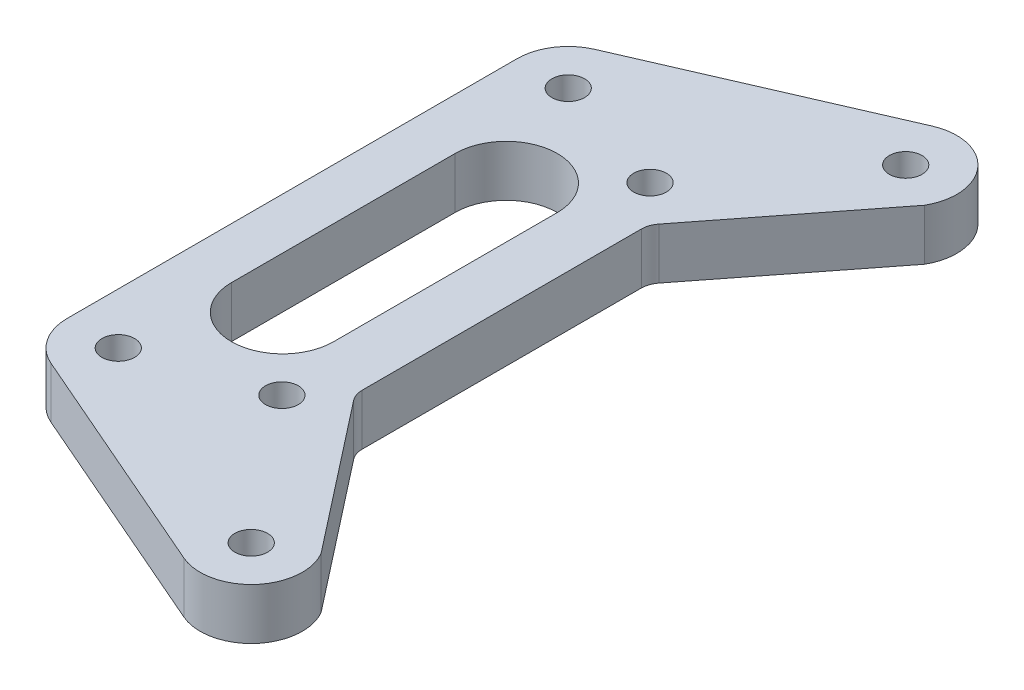
ISO-10303-21;
HEADER;
FILE_DESCRIPTION(('STEP AP214'),'2;1');
FILE_NAME('part.step','',(''),(''),'','','');
FILE_SCHEMA(('AUTOMOTIVE_DESIGN { 1 0 10303 214 1 1 1 1 }'));
ENDSEC;
DATA;
#1=APPLICATION_CONTEXT('core data for automotive mechanical design processes');
#2=APPLICATION_PROTOCOL_DEFINITION('international standard','automotive_design',2000,#1);
#3=PRODUCT_CONTEXT('',#1,'mechanical');
#4=PRODUCT('Part','Part','',(#3));
#5=PRODUCT_RELATED_PRODUCT_CATEGORY('part','',(#4));
#6=PRODUCT_DEFINITION_FORMATION('','',#4);
#7=PRODUCT_DEFINITION_CONTEXT('part definition',#1,'design');
#8=PRODUCT_DEFINITION('design','',#6,#7);
#9=PRODUCT_DEFINITION_SHAPE('','',#8);
#10=(LENGTH_UNIT() NAMED_UNIT(*) SI_UNIT(.MILLI.,.METRE.));
#11=(NAMED_UNIT(*) PLANE_ANGLE_UNIT() SI_UNIT($,.RADIAN.));
#12=(NAMED_UNIT(*) SI_UNIT($,.STERADIAN.) SOLID_ANGLE_UNIT());
#13=UNCERTAINTY_MEASURE_WITH_UNIT(LENGTH_MEASURE(1.E-05),#10,'distance_accuracy_value','');
#14=(GEOMETRIC_REPRESENTATION_CONTEXT(3) GLOBAL_UNCERTAINTY_ASSIGNED_CONTEXT((#13)) GLOBAL_UNIT_ASSIGNED_CONTEXT((#10,
#11,#12)) REPRESENTATION_CONTEXT('',''));
#15=CARTESIAN_POINT('',(0.,0.,0.));
#16=DIRECTION('',(0.,0.,1.));
#17=DIRECTION('',(1.,0.,0.));
#18=AXIS2_PLACEMENT_3D('',#15,#16,#17);
#19=CARTESIAN_POINT('',(2.58602666366907,5.,18.));
#20=DIRECTION('',(0.,-1.,0.));
#21=DIRECTION('',(0.,0.,-1.));
#22=AXIS2_PLACEMENT_3D('',#19,#20,#21);
#23=CYLINDRICAL_SURFACE('',#22,1.6);
#24=CARTESIAN_POINT('',(2.58602666366907,5.,18.));
#25=DIRECTION('',(0.,1.,0.));
#26=DIRECTION('',(0.,0.,-1.));
#27=AXIS2_PLACEMENT_3D('',#24,#25,#26);
#28=CIRCLE('',#27,1.6);
#29=CARTESIAN_POINT('',(2.58602666366907,5.,16.4));
#30=VERTEX_POINT('',#29);
#31=EDGE_CURVE('E196',#30,#30,#28,.T.);
#32=ORIENTED_EDGE('',*,*,#31,.T.);
#33=EDGE_LOOP('',(#32));
#34=FACE_BOUND('',#33,.T.);
#35=CARTESIAN_POINT('',(2.58602666366907,2.5,18.));
#36=DIRECTION('',(0.,-1.,0.));
#37=DIRECTION('',(0.,0.,-1.));
#38=AXIS2_PLACEMENT_3D('',#35,#36,#37);
#39=CIRCLE('',#38,1.6);
#40=CARTESIAN_POINT('',(2.58602666366907,2.5,16.4));
#41=VERTEX_POINT('',#40);
#42=EDGE_CURVE('E37',#41,#41,#39,.T.);
#43=ORIENTED_EDGE('',*,*,#42,.T.);
#44=EDGE_LOOP('',(#43));
#45=FACE_BOUND('',#44,.T.);
#46=ADVANCED_FACE('F33',(#34,#45),#23,.F.);
#47=CARTESIAN_POINT('',(2.58602666366907,5.,-18.));
#48=DIRECTION('',(0.,-1.,0.));
#49=DIRECTION('',(0.,0.,-1.));
#50=AXIS2_PLACEMENT_3D('',#47,#48,#49);
#51=CYLINDRICAL_SURFACE('',#50,1.6);
#52=CARTESIAN_POINT('',(2.58602666366907,5.,-18.));
#53=DIRECTION('',(0.,1.,0.));
#54=DIRECTION('',(0.,0.,1.));
#55=AXIS2_PLACEMENT_3D('',#52,#53,#54);
#56=CIRCLE('',#55,1.6);
#57=CARTESIAN_POINT('',(2.58602666366907,5.,-16.4));
#58=VERTEX_POINT('',#57);
#59=EDGE_CURVE('E201',#58,#58,#56,.T.);
#60=ORIENTED_EDGE('',*,*,#59,.T.);
#61=EDGE_LOOP('',(#60));
#62=FACE_BOUND('',#61,.T.);
#63=CARTESIAN_POINT('',(2.58602666366907,2.5,-18.));
#64=DIRECTION('',(0.,-1.,0.));
#65=DIRECTION('',(0.,0.,-1.));
#66=AXIS2_PLACEMENT_3D('',#63,#64,#65);
#67=CIRCLE('',#66,1.6);
#68=CARTESIAN_POINT('',(2.58602666366907,2.5,-19.6));
#69=VERTEX_POINT('',#68);
#70=EDGE_CURVE('E177',#69,#69,#67,.T.);
#71=ORIENTED_EDGE('',*,*,#70,.T.);
#72=EDGE_LOOP('',(#71));
#73=FACE_BOUND('',#72,.T.);
#74=ADVANCED_FACE('F330',(#62,#73),#51,.F.);
#75=CARTESIAN_POINT('',(8.15816423750236,5.,13.646692882615));
#76=DIRECTION('',(0.,-1.,0.));
#77=DIRECTION('',(0.,0.,-1.));
#78=AXIS2_PLACEMENT_3D('',#75,#76,#77);
#79=PLANE('',#78);
#80=CARTESIAN_POINT('',(-9.41397333633094,5.,22.));
#81=DIRECTION('',(0.,1.,0.));
#82=DIRECTION('',(0.,0.,-1.));
#83=AXIS2_PLACEMENT_3D('',#80,#81,#82);
#84=CIRCLE('',#83,1.6);
#85=CARTESIAN_POINT('',(-9.41397333633094,5.,20.4));
#86=VERTEX_POINT('',#85);
#87=EDGE_CURVE('E187',#86,#86,#84,.T.);
#88=ORIENTED_EDGE('',*,*,#87,.F.);
#89=EDGE_LOOP('',(#88));
#90=FACE_BOUND('',#89,.T.);
#91=ORIENTED_EDGE('',*,*,#31,.F.);
#92=EDGE_LOOP('',(#91));
#93=FACE_BOUND('',#92,.T.);
#94=CARTESIAN_POINT('',(13.5860266636691,5.,-32.));
#95=DIRECTION('',(0.,1.,0.));
#96=DIRECTION('',(0.,0.,1.));
#97=AXIS2_PLACEMENT_3D('',#94,#95,#96);
#98=CIRCLE('',#97,1.6);
#99=CARTESIAN_POINT('',(13.5860266636691,5.,-30.4));
#100=VERTEX_POINT('',#99);
#101=EDGE_CURVE('E205',#100,#100,#98,.T.);
#102=ORIENTED_EDGE('',*,*,#101,.F.);
#103=EDGE_LOOP('',(#102));
#104=FACE_BOUND('',#103,.T.);
#105=CARTESIAN_POINT('',(8.15816423750236,5.,13.646692882615));
#106=DIRECTION('',(0.,-1.,0.));
#107=DIRECTION('',(0.,0.,-1.));
#108=AXIS2_PLACEMENT_3D('',#105,#106,#107);
#109=CIRCLE('',#108,2.07106781186542);
#110=CARTESIAN_POINT('',(6.52612292783099,5.,14.9217470167093));
#111=VERTEX_POINT('',#110);
#112=CARTESIAN_POINT('',(6.08709642563693,5.,13.6466928826149));
#113=VERTEX_POINT('',#112);
#114=EDGE_CURVE('E217',#111,#113,#109,.T.);
#115=ORIENTED_EDGE('',*,*,#114,.T.);
#116=DIRECTION('',(0.,0.,-1.));
#117=VECTOR('',#116,1.);
#118=CARTESIAN_POINT('',(6.08709642563693,5.,-13.6466928826149));
#119=LINE('',#118,#117);
#120=CARTESIAN_POINT('',(6.08709642563693,5.,-13.6466928826149));
#121=VERTEX_POINT('',#120);
#122=EDGE_CURVE('E220',#113,#121,#119,.T.);
#123=ORIENTED_EDGE('',*,*,#122,.T.);
#124=CARTESIAN_POINT('',(8.15816423750236,5.,-13.646692882615));
#125=DIRECTION('',(0.,-1.,0.));
#126=DIRECTION('',(0.,0.,1.));
#127=AXIS2_PLACEMENT_3D('',#124,#125,#126);
#128=CIRCLE('',#127,2.07106781186542);
#129=CARTESIAN_POINT('',(6.52612292783099,5.,-14.9217470167093));
#130=VERTEX_POINT('',#129);
#131=EDGE_CURVE('E223',#121,#130,#128,.T.);
#132=ORIENTED_EDGE('',*,*,#131,.T.);
#133=DIRECTION('',(0.615650596658122,0.,-0.788019252832378));
#134=VECTOR('',#133,1.);
#135=CARTESIAN_POINT('',(6.52612292783099,5.,-14.9217470167093));
#136=LINE('',#135,#134);
#137=CARTESIAN_POINT('',(17.917777995013,5.,-29.5028155047335));
#138=VERTEX_POINT('',#137);
#139=EDGE_CURVE('E225',#130,#138,#136,.T.);
#140=ORIENTED_EDGE('',*,*,#139,.T.);
#141=CARTESIAN_POINT('',(13.5860266636691,5.,-32.));
#142=DIRECTION('',(0.,1.,0.));
#143=DIRECTION('',(0.,0.,1.));
#144=AXIS2_PLACEMENT_3D('',#141,#142,#143);
#145=CIRCLE('',#144,5.);
#146=CARTESIAN_POINT('',(11.5923961065968,5.,-36.5853502812662));
#147=VERTEX_POINT('',#146);
#148=EDGE_CURVE('E227',#138,#147,#145,.T.);
#149=ORIENTED_EDGE('',*,*,#148,.T.);
#150=DIRECTION('',(-0.917070056253235,0.,0.39872611141445));
#151=VECTOR('',#150,1.);
#152=CARTESIAN_POINT('',(-11.4076038934032,5.,-26.5853502812662));
#153=LINE('',#152,#151);
#154=CARTESIAN_POINT('',(-11.4076038934032,5.,-26.5853502812662));
#155=VERTEX_POINT('',#154);
#156=EDGE_CURVE('E229',#147,#155,#153,.T.);
#157=ORIENTED_EDGE('',*,*,#156,.T.);
#158=CARTESIAN_POINT('',(-9.41397333633094,5.,-22.));
#159=DIRECTION('',(0.,1.,0.));
#160=DIRECTION('',(0.,0.,1.));
#161=AXIS2_PLACEMENT_3D('',#158,#159,#160);
#162=CIRCLE('',#161,5.);
#163=CARTESIAN_POINT('',(-14.4139733363309,5.,-22.));
#164=VERTEX_POINT('',#163);
#165=EDGE_CURVE('E231',#155,#164,#162,.T.);
#166=ORIENTED_EDGE('',*,*,#165,.T.);
#167=DIRECTION('',(0.,0.,1.));
#168=VECTOR('',#167,1.);
#169=CARTESIAN_POINT('',(-14.4139733363309,5.,-22.));
#170=LINE('',#169,#168);
#171=CARTESIAN_POINT('',(-14.4139733363309,5.,22.));
#172=VERTEX_POINT('',#171);
#173=EDGE_CURVE('E233',#164,#172,#170,.T.);
#174=ORIENTED_EDGE('',*,*,#173,.T.);
#175=CARTESIAN_POINT('',(-9.41397333633094,5.,22.));
#176=DIRECTION('',(0.,1.,0.));
#177=DIRECTION('',(0.,0.,-1.));
#178=AXIS2_PLACEMENT_3D('',#175,#176,#177);
#179=CIRCLE('',#178,5.);
#180=CARTESIAN_POINT('',(-11.4076038934032,5.,26.5853502812662));
#181=VERTEX_POINT('',#180);
#182=EDGE_CURVE('E235',#172,#181,#179,.T.);
#183=ORIENTED_EDGE('',*,*,#182,.T.);
#184=DIRECTION('',(0.917070056253235,0.,0.39872611141445));
#185=VECTOR('',#184,1.);
#186=CARTESIAN_POINT('',(-11.4076038934032,5.,26.5853502812662));
#187=LINE('',#186,#185);
#188=CARTESIAN_POINT('',(11.5923961065968,5.,36.5853502812662));
#189=VERTEX_POINT('',#188);
#190=EDGE_CURVE('E237',#181,#189,#187,.T.);
#191=ORIENTED_EDGE('',*,*,#190,.T.);
#192=CARTESIAN_POINT('',(13.5860266636691,5.,32.));
#193=DIRECTION('',(0.,1.,0.));
#194=DIRECTION('',(0.,0.,-1.));
#195=AXIS2_PLACEMENT_3D('',#192,#193,#194);
#196=CIRCLE('',#195,5.);
#197=CARTESIAN_POINT('',(17.9177779950131,5.,29.5028155047335));
#198=VERTEX_POINT('',#197);
#199=EDGE_CURVE('E239',#189,#198,#196,.T.);
#200=ORIENTED_EDGE('',*,*,#199,.T.);
#201=DIRECTION('',(-0.615650596658122,0.,-0.788019252832378));
#202=VECTOR('',#201,1.);
#203=CARTESIAN_POINT('',(6.52612292783099,5.,14.9217470167093));
#204=LINE('',#203,#202);
#205=EDGE_CURVE('E241',#198,#111,#204,.T.);
#206=ORIENTED_EDGE('',*,*,#205,.T.);
#207=EDGE_LOOP('',(#115,#123,#132,#140,#149,#157,#166,#174,#183,#191,#200,#206));
#208=FACE_BOUND('',#207,.T.);
#209=CARTESIAN_POINT('',(-9.41397333633094,5.,-22.));
#210=DIRECTION('',(0.,1.,0.));
#211=DIRECTION('',(0.,0.,1.));
#212=AXIS2_PLACEMENT_3D('',#209,#210,#211);
#213=CIRCLE('',#212,1.6);
#214=CARTESIAN_POINT('',(-9.41397333633094,5.,-20.4));
#215=VERTEX_POINT('',#214);
#216=EDGE_CURVE('E211',#215,#215,#213,.T.);
#217=ORIENTED_EDGE('',*,*,#216,.F.);
#218=EDGE_LOOP('',(#217));
#219=FACE_BOUND('',#218,.T.);
#220=ORIENTED_EDGE('',*,*,#59,.F.);
#221=EDGE_LOOP('',(#220));
#222=FACE_BOUND('',#221,.T.);
#223=CARTESIAN_POINT('',(13.5860266636691,5.,32.));
#224=DIRECTION('',(0.,1.,0.));
#225=DIRECTION('',(0.,0.,-1.));
#226=AXIS2_PLACEMENT_3D('',#223,#224,#225);
#227=CIRCLE('',#226,1.6);
#228=CARTESIAN_POINT('',(13.5860266636691,5.,30.4));
#229=VERTEX_POINT('',#228);
#230=EDGE_CURVE('E193',#229,#229,#227,.T.);
#231=ORIENTED_EDGE('',*,*,#230,.F.);
#232=EDGE_LOOP('',(#231));
#233=FACE_BOUND('',#232,.T.);
#234=CARTESIAN_POINT('',(-4.41397333633093,5.,10.9356848269755));
#235=DIRECTION('',(0.,1.,0.));
#236=DIRECTION('',(0.,0.,-1.));
#237=AXIS2_PLACEMENT_3D('',#234,#235,#236);
#238=CIRCLE('',#237,5.);
#239=CARTESIAN_POINT('',(-9.41397333633094,5.,10.9356848269755));
#240=VERTEX_POINT('',#239);
#241=CARTESIAN_POINT('',(0.586026663669074,5.,10.9356848269755));
#242=VERTEX_POINT('',#241);
#243=EDGE_CURVE('E148',#240,#242,#238,.T.);
#244=ORIENTED_EDGE('',*,*,#243,.F.);
#245=DIRECTION('',(0.,0.,1.));
#246=VECTOR('',#245,1.);
#247=CARTESIAN_POINT('',(-9.41397333633094,5.,-10.9356848269755));
#248=LINE('',#247,#246);
#249=CARTESIAN_POINT('',(-9.41397333633094,5.,-10.9356848269755));
#250=VERTEX_POINT('',#249);
#251=EDGE_CURVE('E171',#250,#240,#248,.T.);
#252=ORIENTED_EDGE('',*,*,#251,.F.);
#253=CARTESIAN_POINT('',(-4.41397333633093,5.,-10.9356848269755));
#254=DIRECTION('',(0.,1.,0.));
#255=DIRECTION('',(0.,0.,1.));
#256=AXIS2_PLACEMENT_3D('',#253,#254,#255);
#257=CIRCLE('',#256,5.);
#258=CARTESIAN_POINT('',(0.586026663669074,5.,-10.9356848269755));
#259=VERTEX_POINT('',#258);
#260=EDGE_CURVE('E169',#259,#250,#257,.T.);
#261=ORIENTED_EDGE('',*,*,#260,.F.);
#262=DIRECTION('',(0.,0.,-1.));
#263=VECTOR('',#262,1.);
#264=CARTESIAN_POINT('',(0.586026663669074,5.,-10.9356848269755));
#265=LINE('',#264,#263);
#266=EDGE_CURVE('E156',#242,#259,#265,.T.);
#267=ORIENTED_EDGE('',*,*,#266,.F.);
#268=EDGE_LOOP('',(#244,#252,#261,#267));
#269=FACE_BOUND('',#268,.T.);
#270=ADVANCED_FACE('F168',(#90,#93,#104,#208,#219,#222,#233,#269),#79,.F.);
#271=CARTESIAN_POINT('',(8.15816423750236,0.,13.646692882615));
#272=DIRECTION('',(0.,-1.,0.));
#273=DIRECTION('',(0.,0.,-1.));
#274=AXIS2_PLACEMENT_3D('',#271,#272,#273);
#275=PLANE('',#274);
#276=CARTESIAN_POINT('',(2.58602666366907,0.,18.));
#277=DIRECTION('',(0.,-1.,0.));
#278=DIRECTION('',(0.,0.,-1.));
#279=AXIS2_PLACEMENT_3D('',#276,#277,#278);
#280=CIRCLE('',#279,3.);
#281=CARTESIAN_POINT('',(2.58602666366907,0.,15.));
#282=VERTEX_POINT('',#281);
#283=EDGE_CURVE('E308',#282,#282,#280,.T.);
#284=ORIENTED_EDGE('',*,*,#283,.F.);
#285=EDGE_LOOP('',(#284));
#286=FACE_BOUND('',#285,.T.);
#287=CARTESIAN_POINT('',(2.58602666366907,0.,-18.));
#288=DIRECTION('',(0.,-1.,0.));
#289=DIRECTION('',(0.,0.,-1.));
#290=AXIS2_PLACEMENT_3D('',#287,#288,#289);
#291=CIRCLE('',#290,3.);
#292=CARTESIAN_POINT('',(2.58602666366907,0.,-21.));
#293=VERTEX_POINT('',#292);
#294=EDGE_CURVE('E302',#293,#293,#291,.T.);
#295=ORIENTED_EDGE('',*,*,#294,.F.);
#296=EDGE_LOOP('',(#295));
#297=FACE_BOUND('',#296,.T.);
#298=CARTESIAN_POINT('',(-9.41397333633094,0.,22.));
#299=DIRECTION('',(0.,1.,0.));
#300=DIRECTION('',(0.,0.,-1.));
#301=AXIS2_PLACEMENT_3D('',#298,#299,#300);
#302=CIRCLE('',#301,1.6);
#303=CARTESIAN_POINT('',(-9.41397333633094,0.,20.4));
#304=VERTEX_POINT('',#303);
#305=EDGE_CURVE('E164',#304,#304,#302,.T.);
#306=ORIENTED_EDGE('',*,*,#305,.T.);
#307=EDGE_LOOP('',(#306));
#308=FACE_BOUND('',#307,.T.);
#309=CARTESIAN_POINT('',(13.5860266636691,0.,-32.));
#310=DIRECTION('',(0.,1.,0.));
#311=DIRECTION('',(0.,0.,1.));
#312=AXIS2_PLACEMENT_3D('',#309,#310,#311);
#313=CIRCLE('',#312,1.6);
#314=CARTESIAN_POINT('',(13.5860266636691,0.,-30.4));
#315=VERTEX_POINT('',#314);
#316=EDGE_CURVE('E204',#315,#315,#313,.T.);
#317=ORIENTED_EDGE('',*,*,#316,.T.);
#318=EDGE_LOOP('',(#317));
#319=FACE_BOUND('',#318,.T.);
#320=CARTESIAN_POINT('',(8.15816423750236,0.,13.646692882615));
#321=DIRECTION('',(0.,-1.,0.));
#322=DIRECTION('',(0.,0.,-1.));
#323=AXIS2_PLACEMENT_3D('',#320,#321,#322);
#324=CIRCLE('',#323,2.07106781186542);
#325=CARTESIAN_POINT('',(6.52612292783099,0.,14.9217470167093));
#326=VERTEX_POINT('',#325);
#327=CARTESIAN_POINT('',(6.08709642563693,0.,13.6466928826149));
#328=VERTEX_POINT('',#327);
#329=EDGE_CURVE('E214',#326,#328,#324,.T.);
#330=ORIENTED_EDGE('',*,*,#329,.F.);
#331=DIRECTION('',(-0.615650596658122,0.,-0.788019252832378));
#332=VECTOR('',#331,1.);
#333=CARTESIAN_POINT('',(6.52612292783099,0.,14.9217470167093));
#334=LINE('',#333,#332);
#335=CARTESIAN_POINT('',(17.9177779950131,0.,29.5028155047335));
#336=VERTEX_POINT('',#335);
#337=EDGE_CURVE('E221',#336,#326,#334,.T.);
#338=ORIENTED_EDGE('',*,*,#337,.F.);
#339=CARTESIAN_POINT('',(13.5860266636691,0.,32.));
#340=DIRECTION('',(0.,1.,0.));
#341=DIRECTION('',(0.,0.,-1.));
#342=AXIS2_PLACEMENT_3D('',#339,#340,#341);
#343=CIRCLE('',#342,5.);
#344=CARTESIAN_POINT('',(11.5923961065968,0.,36.5853502812662));
#345=VERTEX_POINT('',#344);
#346=EDGE_CURVE('E264',#345,#336,#343,.T.);
#347=ORIENTED_EDGE('',*,*,#346,.F.);
#348=DIRECTION('',(0.917070056253235,0.,0.39872611141445));
#349=VECTOR('',#348,1.);
#350=CARTESIAN_POINT('',(-11.4076038934032,0.,26.5853502812662));
#351=LINE('',#350,#349);
#352=CARTESIAN_POINT('',(-11.4076038934032,0.,26.5853502812662));
#353=VERTEX_POINT('',#352);
#354=EDGE_CURVE('E262',#353,#345,#351,.T.);
#355=ORIENTED_EDGE('',*,*,#354,.F.);
#356=CARTESIAN_POINT('',(-9.41397333633094,0.,22.));
#357=DIRECTION('',(0.,1.,0.));
#358=DIRECTION('',(0.,0.,-1.));
#359=AXIS2_PLACEMENT_3D('',#356,#357,#358);
#360=CIRCLE('',#359,5.);
#361=CARTESIAN_POINT('',(-14.4139733363309,0.,22.));
#362=VERTEX_POINT('',#361);
#363=EDGE_CURVE('E260',#362,#353,#360,.T.);
#364=ORIENTED_EDGE('',*,*,#363,.F.);
#365=DIRECTION('',(0.,0.,1.));
#366=VECTOR('',#365,1.);
#367=CARTESIAN_POINT('',(-14.4139733363309,0.,-22.));
#368=LINE('',#367,#366);
#369=CARTESIAN_POINT('',(-14.4139733363309,0.,-22.));
#370=VERTEX_POINT('',#369);
#371=EDGE_CURVE('E258',#370,#362,#368,.T.);
#372=ORIENTED_EDGE('',*,*,#371,.F.);
#373=CARTESIAN_POINT('',(-9.41397333633094,0.,-22.));
#374=DIRECTION('',(0.,1.,0.));
#375=DIRECTION('',(0.,0.,1.));
#376=AXIS2_PLACEMENT_3D('',#373,#374,#375);
#377=CIRCLE('',#376,5.);
#378=CARTESIAN_POINT('',(-11.4076038934032,0.,-26.5853502812662));
#379=VERTEX_POINT('',#378);
#380=EDGE_CURVE('E256',#379,#370,#377,.T.);
#381=ORIENTED_EDGE('',*,*,#380,.F.);
#382=DIRECTION('',(-0.917070056253235,0.,0.39872611141445));
#383=VECTOR('',#382,1.);
#384=CARTESIAN_POINT('',(-11.4076038934032,0.,-26.5853502812662));
#385=LINE('',#384,#383);
#386=CARTESIAN_POINT('',(11.5923961065968,0.,-36.5853502812662));
#387=VERTEX_POINT('',#386);
#388=EDGE_CURVE('E254',#387,#379,#385,.T.);
#389=ORIENTED_EDGE('',*,*,#388,.F.);
#390=CARTESIAN_POINT('',(13.5860266636691,0.,-32.));
#391=DIRECTION('',(0.,1.,0.));
#392=DIRECTION('',(0.,0.,1.));
#393=AXIS2_PLACEMENT_3D('',#390,#391,#392);
#394=CIRCLE('',#393,5.);
#395=CARTESIAN_POINT('',(17.917777995013,0.,-29.5028155047335));
#396=VERTEX_POINT('',#395);
#397=EDGE_CURVE('E252',#396,#387,#394,.T.);
#398=ORIENTED_EDGE('',*,*,#397,.F.);
#399=DIRECTION('',(0.615650596658122,0.,-0.788019252832378));
#400=VECTOR('',#399,1.);
#401=CARTESIAN_POINT('',(6.52612292783099,0.,-14.9217470167093));
#402=LINE('',#401,#400);
#403=CARTESIAN_POINT('',(6.52612292783099,0.,-14.9217470167093));
#404=VERTEX_POINT('',#403);
#405=EDGE_CURVE('E250',#404,#396,#402,.T.);
#406=ORIENTED_EDGE('',*,*,#405,.F.);
#407=CARTESIAN_POINT('',(8.15816423750236,0.,-13.646692882615));
#408=DIRECTION('',(0.,-1.,0.));
#409=DIRECTION('',(0.,0.,1.));
#410=AXIS2_PLACEMENT_3D('',#407,#408,#409);
#411=CIRCLE('',#410,2.07106781186542);
#412=CARTESIAN_POINT('',(6.08709642563693,0.,-13.6466928826149));
#413=VERTEX_POINT('',#412);
#414=EDGE_CURVE('E248',#413,#404,#411,.T.);
#415=ORIENTED_EDGE('',*,*,#414,.F.);
#416=DIRECTION('',(0.,0.,-1.));
#417=VECTOR('',#416,1.);
#418=CARTESIAN_POINT('',(6.08709642563693,0.,-13.6466928826149));
#419=LINE('',#418,#417);
#420=EDGE_CURVE('E246',#328,#413,#419,.T.);
#421=ORIENTED_EDGE('',*,*,#420,.F.);
#422=EDGE_LOOP('',(#330,#338,#347,#355,#364,#372,#381,#389,#398,#406,#415,#421));
#423=FACE_BOUND('',#422,.T.);
#424=CARTESIAN_POINT('',(-9.41397333633094,0.,-22.));
#425=DIRECTION('',(0.,1.,0.));
#426=DIRECTION('',(0.,0.,1.));
#427=AXIS2_PLACEMENT_3D('',#424,#425,#426);
#428=CIRCLE('',#427,1.6);
#429=CARTESIAN_POINT('',(-9.41397333633094,0.,-20.4));
#430=VERTEX_POINT('',#429);
#431=EDGE_CURVE('E208',#430,#430,#428,.T.);
#432=ORIENTED_EDGE('',*,*,#431,.T.);
#433=EDGE_LOOP('',(#432));
#434=FACE_BOUND('',#433,.T.);
#435=CARTESIAN_POINT('',(13.5860266636691,0.,32.));
#436=DIRECTION('',(0.,1.,0.));
#437=DIRECTION('',(0.,0.,-1.));
#438=AXIS2_PLACEMENT_3D('',#435,#436,#437);
#439=CIRCLE('',#438,1.6);
#440=CARTESIAN_POINT('',(13.5860266636691,0.,30.4));
#441=VERTEX_POINT('',#440);
#442=EDGE_CURVE('E190',#441,#441,#439,.T.);
#443=ORIENTED_EDGE('',*,*,#442,.T.);
#444=EDGE_LOOP('',(#443));
#445=FACE_BOUND('',#444,.T.);
#446=DIRECTION('',(0.,0.,1.));
#447=VECTOR('',#446,1.);
#448=CARTESIAN_POINT('',(-9.41397333633094,0.,-10.9356848269755));
#449=LINE('',#448,#447);
#450=CARTESIAN_POINT('',(-9.41397333633094,0.,-10.9356848269755));
#451=VERTEX_POINT('',#450);
#452=CARTESIAN_POINT('',(-9.41397333633094,0.,10.9356848269755));
#453=VERTEX_POINT('',#452);
#454=EDGE_CURVE('E157',#451,#453,#449,.T.);
#455=ORIENTED_EDGE('',*,*,#454,.T.);
#456=CARTESIAN_POINT('',(-4.41397333633093,0.,10.9356848269755));
#457=DIRECTION('',(0.,1.,0.));
#458=DIRECTION('',(0.,0.,-1.));
#459=AXIS2_PLACEMENT_3D('',#456,#457,#458);
#460=CIRCLE('',#459,5.);
#461=CARTESIAN_POINT('',(0.586026663669074,0.,10.9356848269755));
#462=VERTEX_POINT('',#461);
#463=EDGE_CURVE('E58',#453,#462,#460,.T.);
#464=ORIENTED_EDGE('',*,*,#463,.T.);
#465=DIRECTION('',(0.,0.,-1.));
#466=VECTOR('',#465,1.);
#467=CARTESIAN_POINT('',(0.586026663669074,0.,-10.9356848269755));
#468=LINE('',#467,#466);
#469=CARTESIAN_POINT('',(0.586026663669074,0.,-10.9356848269755));
#470=VERTEX_POINT('',#469);
#471=EDGE_CURVE('E163',#462,#470,#468,.T.);
#472=ORIENTED_EDGE('',*,*,#471,.T.);
#473=CARTESIAN_POINT('',(-4.41397333633093,0.,-10.9356848269755));
#474=DIRECTION('',(0.,1.,0.));
#475=DIRECTION('',(0.,0.,1.));
#476=AXIS2_PLACEMENT_3D('',#473,#474,#475);
#477=CIRCLE('',#476,5.);
#478=EDGE_CURVE('E179',#470,#451,#477,.T.);
#479=ORIENTED_EDGE('',*,*,#478,.T.);
#480=EDGE_LOOP('',(#455,#464,#472,#479));
#481=FACE_BOUND('',#480,.T.);
#482=ADVANCED_FACE('F353',(#286,#297,#308,#319,#423,#434,#445,#481),#275,.T.);
#483=CARTESIAN_POINT('',(8.15816423750236,5.,13.646692882615));
#484=DIRECTION('',(0.,-1.,0.));
#485=DIRECTION('',(0.,0.,-1.));
#486=AXIS2_PLACEMENT_3D('',#483,#484,#485);
#487=CYLINDRICAL_SURFACE('',#486,2.07106781186542);
#488=ORIENTED_EDGE('',*,*,#329,.T.);
#489=DIRECTION('',(0.,-1.,0.));
#490=VECTOR('',#489,1.);
#491=CARTESIAN_POINT('',(6.08709642563693,5.,13.6466928826149));
#492=LINE('',#491,#490);
#493=EDGE_CURVE('E11',#113,#328,#492,.T.);
#494=ORIENTED_EDGE('',*,*,#493,.F.);
#495=ORIENTED_EDGE('',*,*,#114,.F.);
#496=DIRECTION('',(0.,-1.,0.));
#497=VECTOR('',#496,1.);
#498=CARTESIAN_POINT('',(6.52612292783099,5.,14.9217470167093));
#499=LINE('',#498,#497);
#500=EDGE_CURVE('E243',#111,#326,#499,.T.);
#501=ORIENTED_EDGE('',*,*,#500,.T.);
#502=EDGE_LOOP('',(#488,#494,#495,#501));
#503=FACE_BOUND('',#502,.T.);
#504=ADVANCED_FACE('F35',(#503),#487,.F.);
#505=CARTESIAN_POINT('',(6.08709642563693,5.,-13.6466928826149));
#506=DIRECTION('',(-1.,0.,0.));
#507=DIRECTION('',(0.,0.,1.));
#508=AXIS2_PLACEMENT_3D('',#505,#506,#507);
#509=PLANE('',#508);
#510=ORIENTED_EDGE('',*,*,#420,.T.);
#511=DIRECTION('',(0.,-1.,0.));
#512=VECTOR('',#511,1.);
#513=CARTESIAN_POINT('',(6.08709642563693,5.,-13.6466928826149));
#514=LINE('',#513,#512);
#515=EDGE_CURVE('E42',#121,#413,#514,.T.);
#516=ORIENTED_EDGE('',*,*,#515,.F.);
#517=ORIENTED_EDGE('',*,*,#122,.F.);
#518=ORIENTED_EDGE('',*,*,#493,.T.);
#519=EDGE_LOOP('',(#510,#516,#517,#518));
#520=FACE_BOUND('',#519,.T.);
#521=ADVANCED_FACE('F395',(#520),#509,.F.);
#522=CARTESIAN_POINT('',(8.15816423750236,5.,-13.646692882615));
#523=DIRECTION('',(0.,-1.,0.));
#524=DIRECTION('',(0.,0.,-1.));
#525=AXIS2_PLACEMENT_3D('',#522,#523,#524);
#526=CYLINDRICAL_SURFACE('',#525,2.07106781186542);
#527=ORIENTED_EDGE('',*,*,#414,.T.);
#528=DIRECTION('',(0.,-1.,0.));
#529=VECTOR('',#528,1.);
#530=CARTESIAN_POINT('',(6.52612292783099,5.,-14.9217470167093));
#531=LINE('',#530,#529);
#532=EDGE_CURVE('E293',#130,#404,#531,.T.);
#533=ORIENTED_EDGE('',*,*,#532,.F.);
#534=ORIENTED_EDGE('',*,*,#131,.F.);
#535=ORIENTED_EDGE('',*,*,#515,.T.);
#536=EDGE_LOOP('',(#527,#533,#534,#535));
#537=FACE_BOUND('',#536,.T.);
#538=ADVANCED_FACE('F392',(#537),#526,.F.);
#539=CARTESIAN_POINT('',(6.52612292783099,5.,-14.9217470167093));
#540=DIRECTION('',(-0.788019252832378,0.,-0.615650596658122));
#541=DIRECTION('',(-0.615650596658122,0.,0.788019252832378));
#542=AXIS2_PLACEMENT_3D('',#539,#540,#541);
#543=PLANE('',#542);
#544=ORIENTED_EDGE('',*,*,#405,.T.);
#545=DIRECTION('',(0.,-1.,0.));
#546=VECTOR('',#545,1.);
#547=CARTESIAN_POINT('',(17.917777995013,5.,-29.5028155047335));
#548=LINE('',#547,#546);
#549=EDGE_CURVE('E290',#138,#396,#548,.T.);
#550=ORIENTED_EDGE('',*,*,#549,.F.);
#551=ORIENTED_EDGE('',*,*,#139,.F.);
#552=ORIENTED_EDGE('',*,*,#532,.T.);
#553=EDGE_LOOP('',(#544,#550,#551,#552));
#554=FACE_BOUND('',#553,.T.);
#555=ADVANCED_FACE('F388',(#554),#543,.F.);
#556=CARTESIAN_POINT('',(13.5860266636691,5.,-32.));
#557=DIRECTION('',(0.,-1.,0.));
#558=DIRECTION('',(0.,0.,-1.));
#559=AXIS2_PLACEMENT_3D('',#556,#557,#558);
#560=CYLINDRICAL_SURFACE('',#559,5.);
#561=ORIENTED_EDGE('',*,*,#397,.T.);
#562=DIRECTION('',(0.,-1.,0.));
#563=VECTOR('',#562,1.);
#564=CARTESIAN_POINT('',(11.5923961065968,5.,-36.5853502812662));
#565=LINE('',#564,#563);
#566=EDGE_CURVE('E287',#147,#387,#565,.T.);
#567=ORIENTED_EDGE('',*,*,#566,.F.);
#568=ORIENTED_EDGE('',*,*,#148,.F.);
#569=ORIENTED_EDGE('',*,*,#549,.T.);
#570=EDGE_LOOP('',(#561,#567,#568,#569));
#571=FACE_BOUND('',#570,.T.);
#572=ADVANCED_FACE('F384',(#571),#560,.T.);
#573=CARTESIAN_POINT('',(-11.4076038934032,5.,-26.5853502812662));
#574=DIRECTION('',(0.39872611141445,0.,0.917070056253235));
#575=DIRECTION('',(0.917070056253235,0.,-0.39872611141445));
#576=AXIS2_PLACEMENT_3D('',#573,#574,#575);
#577=PLANE('',#576);
#578=ORIENTED_EDGE('',*,*,#388,.T.);
#579=DIRECTION('',(0.,-1.,0.));
#580=VECTOR('',#579,1.);
#581=CARTESIAN_POINT('',(-11.4076038934032,5.,-26.5853502812662));
#582=LINE('',#581,#580);
#583=EDGE_CURVE('E284',#155,#379,#582,.T.);
#584=ORIENTED_EDGE('',*,*,#583,.F.);
#585=ORIENTED_EDGE('',*,*,#156,.F.);
#586=ORIENTED_EDGE('',*,*,#566,.T.);
#587=EDGE_LOOP('',(#578,#584,#585,#586));
#588=FACE_BOUND('',#587,.T.);
#589=ADVANCED_FACE('F380',(#588),#577,.F.);
#590=CARTESIAN_POINT('',(-9.41397333633094,5.,-22.));
#591=DIRECTION('',(0.,-1.,0.));
#592=DIRECTION('',(0.,0.,-1.));
#593=AXIS2_PLACEMENT_3D('',#590,#591,#592);
#594=CYLINDRICAL_SURFACE('',#593,5.);
#595=ORIENTED_EDGE('',*,*,#380,.T.);
#596=DIRECTION('',(0.,-1.,0.));
#597=VECTOR('',#596,1.);
#598=CARTESIAN_POINT('',(-14.4139733363309,5.,-22.));
#599=LINE('',#598,#597);
#600=EDGE_CURVE('E281',#164,#370,#599,.T.);
#601=ORIENTED_EDGE('',*,*,#600,.F.);
#602=ORIENTED_EDGE('',*,*,#165,.F.);
#603=ORIENTED_EDGE('',*,*,#583,.T.);
#604=EDGE_LOOP('',(#595,#601,#602,#603));
#605=FACE_BOUND('',#604,.T.);
#606=ADVANCED_FACE('F376',(#605),#594,.T.);
#607=CARTESIAN_POINT('',(-14.4139733363309,5.,-22.));
#608=DIRECTION('',(1.,0.,0.));
#609=DIRECTION('',(0.,0.,-1.));
#610=AXIS2_PLACEMENT_3D('',#607,#608,#609);
#611=PLANE('',#610);
#612=ORIENTED_EDGE('',*,*,#371,.T.);
#613=DIRECTION('',(0.,-1.,0.));
#614=VECTOR('',#613,1.);
#615=CARTESIAN_POINT('',(-14.4139733363309,5.,22.));
#616=LINE('',#615,#614);
#617=EDGE_CURVE('E278',#172,#362,#616,.T.);
#618=ORIENTED_EDGE('',*,*,#617,.F.);
#619=ORIENTED_EDGE('',*,*,#173,.F.);
#620=ORIENTED_EDGE('',*,*,#600,.T.);
#621=EDGE_LOOP('',(#612,#618,#619,#620));
#622=FACE_BOUND('',#621,.T.);
#623=ADVANCED_FACE('F372',(#622),#611,.F.);
#624=CARTESIAN_POINT('',(-9.41397333633094,5.,22.));
#625=DIRECTION('',(0.,-1.,0.));
#626=DIRECTION('',(0.,0.,-1.));
#627=AXIS2_PLACEMENT_3D('',#624,#625,#626);
#628=CYLINDRICAL_SURFACE('',#627,5.);
#629=ORIENTED_EDGE('',*,*,#363,.T.);
#630=DIRECTION('',(0.,-1.,0.));
#631=VECTOR('',#630,1.);
#632=CARTESIAN_POINT('',(-11.4076038934032,5.,26.5853502812662));
#633=LINE('',#632,#631);
#634=EDGE_CURVE('E275',#181,#353,#633,.T.);
#635=ORIENTED_EDGE('',*,*,#634,.F.);
#636=ORIENTED_EDGE('',*,*,#182,.F.);
#637=ORIENTED_EDGE('',*,*,#617,.T.);
#638=EDGE_LOOP('',(#629,#635,#636,#637));
#639=FACE_BOUND('',#638,.T.);
#640=ADVANCED_FACE('F368',(#639),#628,.T.);
#641=CARTESIAN_POINT('',(-11.4076038934032,5.,26.5853502812662));
#642=DIRECTION('',(0.39872611141445,0.,-0.917070056253235));
#643=DIRECTION('',(-0.917070056253235,0.,-0.39872611141445));
#644=AXIS2_PLACEMENT_3D('',#641,#642,#643);
#645=PLANE('',#644);
#646=ORIENTED_EDGE('',*,*,#354,.T.);
#647=DIRECTION('',(0.,-1.,0.));
#648=VECTOR('',#647,1.);
#649=CARTESIAN_POINT('',(11.5923961065968,5.,36.5853502812662));
#650=LINE('',#649,#648);
#651=EDGE_CURVE('E272',#189,#345,#650,.T.);
#652=ORIENTED_EDGE('',*,*,#651,.F.);
#653=ORIENTED_EDGE('',*,*,#190,.F.);
#654=ORIENTED_EDGE('',*,*,#634,.T.);
#655=EDGE_LOOP('',(#646,#652,#653,#654));
#656=FACE_BOUND('',#655,.T.);
#657=ADVANCED_FACE('F364',(#656),#645,.F.);
#658=CARTESIAN_POINT('',(13.5860266636691,5.,32.));
#659=DIRECTION('',(0.,-1.,0.));
#660=DIRECTION('',(0.,0.,-1.));
#661=AXIS2_PLACEMENT_3D('',#658,#659,#660);
#662=CYLINDRICAL_SURFACE('',#661,5.);
#663=ORIENTED_EDGE('',*,*,#346,.T.);
#664=DIRECTION('',(0.,-1.,0.));
#665=VECTOR('',#664,1.);
#666=CARTESIAN_POINT('',(17.9177779950131,5.,29.5028155047335));
#667=LINE('',#666,#665);
#668=EDGE_CURVE('E269',#198,#336,#667,.T.);
#669=ORIENTED_EDGE('',*,*,#668,.F.);
#670=ORIENTED_EDGE('',*,*,#199,.F.);
#671=ORIENTED_EDGE('',*,*,#651,.T.);
#672=EDGE_LOOP('',(#663,#669,#670,#671));
#673=FACE_BOUND('',#672,.T.);
#674=ADVANCED_FACE('F360',(#673),#662,.T.);
#675=CARTESIAN_POINT('',(6.52612292783099,5.,14.9217470167093));
#676=DIRECTION('',(-0.788019252832378,0.,0.615650596658122));
#677=DIRECTION('',(0.615650596658122,0.,0.788019252832378));
#678=AXIS2_PLACEMENT_3D('',#675,#676,#677);
#679=PLANE('',#678);
#680=ORIENTED_EDGE('',*,*,#337,.T.);
#681=ORIENTED_EDGE('',*,*,#500,.F.);
#682=ORIENTED_EDGE('',*,*,#205,.F.);
#683=ORIENTED_EDGE('',*,*,#668,.T.);
#684=EDGE_LOOP('',(#680,#681,#682,#683));
#685=FACE_BOUND('',#684,.T.);
#686=ADVANCED_FACE('F349',(#685),#679,.F.);
#687=CARTESIAN_POINT('',(-9.41397333633094,5.,-22.));
#688=DIRECTION('',(0.,-1.,0.));
#689=DIRECTION('',(0.,0.,-1.));
#690=AXIS2_PLACEMENT_3D('',#687,#688,#689);
#691=CYLINDRICAL_SURFACE('',#690,1.6);
#692=ORIENTED_EDGE('',*,*,#216,.T.);
#693=EDGE_LOOP('',(#692));
#694=FACE_BOUND('',#693,.T.);
#695=ORIENTED_EDGE('',*,*,#431,.F.);
#696=EDGE_LOOP('',(#695));
#697=FACE_BOUND('',#696,.T.);
#698=ADVANCED_FACE('F345',(#694,#697),#691,.F.);
#699=CARTESIAN_POINT('',(13.5860266636691,5.,-32.));
#700=DIRECTION('',(0.,-1.,0.));
#701=DIRECTION('',(0.,0.,-1.));
#702=AXIS2_PLACEMENT_3D('',#699,#700,#701);
#703=CYLINDRICAL_SURFACE('',#702,1.6);
#704=ORIENTED_EDGE('',*,*,#101,.T.);
#705=EDGE_LOOP('',(#704));
#706=FACE_BOUND('',#705,.T.);
#707=ORIENTED_EDGE('',*,*,#316,.F.);
#708=EDGE_LOOP('',(#707));
#709=FACE_BOUND('',#708,.T.);
#710=ADVANCED_FACE('F342',(#706,#709),#703,.F.);
#711=CARTESIAN_POINT('',(13.5860266636691,5.,32.));
#712=DIRECTION('',(0.,-1.,0.));
#713=DIRECTION('',(0.,0.,-1.));
#714=AXIS2_PLACEMENT_3D('',#711,#712,#713);
#715=CYLINDRICAL_SURFACE('',#714,1.6);
#716=ORIENTED_EDGE('',*,*,#230,.T.);
#717=EDGE_LOOP('',(#716));
#718=FACE_BOUND('',#717,.T.);
#719=ORIENTED_EDGE('',*,*,#442,.F.);
#720=EDGE_LOOP('',(#719));
#721=FACE_BOUND('',#720,.T.);
#722=ADVANCED_FACE('F339',(#718,#721),#715,.F.);
#723=CARTESIAN_POINT('',(-9.41397333633094,5.,22.));
#724=DIRECTION('',(0.,-1.,0.));
#725=DIRECTION('',(0.,0.,-1.));
#726=AXIS2_PLACEMENT_3D('',#723,#724,#725);
#727=CYLINDRICAL_SURFACE('',#726,1.6);
#728=ORIENTED_EDGE('',*,*,#87,.T.);
#729=EDGE_LOOP('',(#728));
#730=FACE_BOUND('',#729,.T.);
#731=ORIENTED_EDGE('',*,*,#305,.F.);
#732=EDGE_LOOP('',(#731));
#733=FACE_BOUND('',#732,.T.);
#734=ADVANCED_FACE('F449',(#730,#733),#727,.F.);
#735=CARTESIAN_POINT('',(-4.41397333633093,5.,10.9356848269755));
#736=DIRECTION('',(0.,-1.,0.));
#737=DIRECTION('',(0.,0.,-1.));
#738=AXIS2_PLACEMENT_3D('',#735,#736,#737);
#739=CYLINDRICAL_SURFACE('',#738,5.);
#740=ORIENTED_EDGE('',*,*,#463,.F.);
#741=DIRECTION('',(0.,-1.,0.));
#742=VECTOR('',#741,1.);
#743=CARTESIAN_POINT('',(-9.41397333633094,5.,10.9356848269755));
#744=LINE('',#743,#742);
#745=EDGE_CURVE('E152',#240,#453,#744,.T.);
#746=ORIENTED_EDGE('',*,*,#745,.F.);
#747=ORIENTED_EDGE('',*,*,#243,.T.);
#748=DIRECTION('',(0.,-1.,0.));
#749=VECTOR('',#748,1.);
#750=CARTESIAN_POINT('',(0.586026663669074,5.,10.9356848269755));
#751=LINE('',#750,#749);
#752=EDGE_CURVE('E151',#242,#462,#751,.T.);
#753=ORIENTED_EDGE('',*,*,#752,.T.);
#754=EDGE_LOOP('',(#740,#746,#747,#753));
#755=FACE_BOUND('',#754,.T.);
#756=ADVANCED_FACE('F150',(#755),#739,.F.);
#757=CARTESIAN_POINT('',(0.586026663669074,5.,-10.9356848269755));
#758=DIRECTION('',(-1.,0.,0.));
#759=DIRECTION('',(0.,0.,1.));
#760=AXIS2_PLACEMENT_3D('',#757,#758,#759);
#761=PLANE('',#760);
#762=ORIENTED_EDGE('',*,*,#471,.F.);
#763=ORIENTED_EDGE('',*,*,#752,.F.);
#764=ORIENTED_EDGE('',*,*,#266,.T.);
#765=DIRECTION('',(0.,-1.,0.));
#766=VECTOR('',#765,1.);
#767=CARTESIAN_POINT('',(0.586026663669074,5.,-10.9356848269755));
#768=LINE('',#767,#766);
#769=EDGE_CURVE('E165',#259,#470,#768,.T.);
#770=ORIENTED_EDGE('',*,*,#769,.T.);
#771=EDGE_LOOP('',(#762,#763,#764,#770));
#772=FACE_BOUND('',#771,.T.);
#773=ADVANCED_FACE('F160',(#772),#761,.T.);
#774=CARTESIAN_POINT('',(-4.41397333633093,5.,-10.9356848269755));
#775=DIRECTION('',(0.,-1.,0.));
#776=DIRECTION('',(0.,0.,-1.));
#777=AXIS2_PLACEMENT_3D('',#774,#775,#776);
#778=CYLINDRICAL_SURFACE('',#777,5.);
#779=ORIENTED_EDGE('',*,*,#478,.F.);
#780=ORIENTED_EDGE('',*,*,#769,.F.);
#781=ORIENTED_EDGE('',*,*,#260,.T.);
#782=DIRECTION('',(0.,-1.,0.));
#783=VECTOR('',#782,1.);
#784=CARTESIAN_POINT('',(-9.41397333633094,5.,-10.9356848269755));
#785=LINE('',#784,#783);
#786=EDGE_CURVE('E50',#250,#451,#785,.T.);
#787=ORIENTED_EDGE('',*,*,#786,.T.);
#788=EDGE_LOOP('',(#779,#780,#781,#787));
#789=FACE_BOUND('',#788,.T.);
#790=ADVANCED_FACE('F457',(#789),#778,.F.);
#791=CARTESIAN_POINT('',(-9.41397333633094,5.,-10.9356848269755));
#792=DIRECTION('',(1.,0.,0.));
#793=DIRECTION('',(0.,0.,-1.));
#794=AXIS2_PLACEMENT_3D('',#791,#792,#793);
#795=PLANE('',#794);
#796=ORIENTED_EDGE('',*,*,#454,.F.);
#797=ORIENTED_EDGE('',*,*,#786,.F.);
#798=ORIENTED_EDGE('',*,*,#251,.T.);
#799=ORIENTED_EDGE('',*,*,#745,.T.);
#800=EDGE_LOOP('',(#796,#797,#798,#799));
#801=FACE_BOUND('',#800,.T.);
#802=ADVANCED_FACE('F454',(#801),#795,.T.);
#803=CARTESIAN_POINT('',(2.58602666366907,2.5,-18.));
#804=DIRECTION('',(0.,-1.,0.));
#805=DIRECTION('',(0.,0.,-1.));
#806=AXIS2_PLACEMENT_3D('',#803,#804,#805);
#807=CYLINDRICAL_SURFACE('',#806,3.);
#808=CARTESIAN_POINT('',(2.58602666366907,2.5,-18.));
#809=DIRECTION('',(0.,-1.,0.));
#810=DIRECTION('',(0.,0.,-1.));
#811=AXIS2_PLACEMENT_3D('',#808,#809,#810);
#812=CIRCLE('',#811,3.);
#813=CARTESIAN_POINT('',(2.58602666366907,2.5,-21.));
#814=VERTEX_POINT('',#813);
#815=EDGE_CURVE('E298',#814,#814,#812,.T.);
#816=ORIENTED_EDGE('',*,*,#815,.F.);
#817=EDGE_LOOP('',(#816));
#818=FACE_BOUND('',#817,.T.);
#819=ORIENTED_EDGE('',*,*,#294,.T.);
#820=EDGE_LOOP('',(#819));
#821=FACE_BOUND('',#820,.T.);
#822=ADVANCED_FACE('F456',(#818,#821),#807,.F.);
#823=CARTESIAN_POINT('',(2.58602666366907,2.5,-18.));
#824=DIRECTION('',(0.,-1.,0.));
#825=DIRECTION('',(0.,0.,-1.));
#826=AXIS2_PLACEMENT_3D('',#823,#824,#825);
#827=PLANE('',#826);
#828=ORIENTED_EDGE('',*,*,#70,.F.);
#829=EDGE_LOOP('',(#828));
#830=FACE_BOUND('',#829,.T.);
#831=ORIENTED_EDGE('',*,*,#815,.T.);
#832=EDGE_LOOP('',(#831));
#833=FACE_BOUND('',#832,.T.);
#834=ADVANCED_FACE('F326',(#830,#833),#827,.T.);
#835=CARTESIAN_POINT('',(2.58602666366907,2.5,18.));
#836=DIRECTION('',(0.,-1.,0.));
#837=DIRECTION('',(0.,0.,-1.));
#838=AXIS2_PLACEMENT_3D('',#835,#836,#837);
#839=CYLINDRICAL_SURFACE('',#838,3.);
#840=CARTESIAN_POINT('',(2.58602666366907,2.5,18.));
#841=DIRECTION('',(0.,-1.,0.));
#842=DIRECTION('',(0.,0.,-1.));
#843=AXIS2_PLACEMENT_3D('',#840,#841,#842);
#844=CIRCLE('',#843,3.);
#845=CARTESIAN_POINT('',(2.58602666366907,2.5,15.));
#846=VERTEX_POINT('',#845);
#847=EDGE_CURVE('E311',#846,#846,#844,.T.);
#848=ORIENTED_EDGE('',*,*,#847,.F.);
#849=EDGE_LOOP('',(#848));
#850=FACE_BOUND('',#849,.T.);
#851=ORIENTED_EDGE('',*,*,#283,.T.);
#852=EDGE_LOOP('',(#851));
#853=FACE_BOUND('',#852,.T.);
#854=ADVANCED_FACE('F321',(#850,#853),#839,.F.);
#855=CARTESIAN_POINT('',(2.58602666366907,2.5,18.));
#856=DIRECTION('',(0.,-1.,0.));
#857=DIRECTION('',(0.,0.,-1.));
#858=AXIS2_PLACEMENT_3D('',#855,#856,#857);
#859=PLANE('',#858);
#860=ORIENTED_EDGE('',*,*,#42,.F.);
#861=EDGE_LOOP('',(#860));
#862=FACE_BOUND('',#861,.T.);
#863=ORIENTED_EDGE('',*,*,#847,.T.);
#864=EDGE_LOOP('',(#863));
#865=FACE_BOUND('',#864,.T.);
#866=ADVANCED_FACE('F319',(#862,#865),#859,.T.);
#867=CLOSED_SHELL('',(#46,#74,#270,#482,#504,#521,#538,#555,#572,#589,#606,#623,#640,#657,#674,
#686,#698,#710,#722,#734,#756,#773,#790,#802,#822,#834,#854,#866));
#868=MANIFOLD_SOLID_BREP('B2',#867);
#869=ADVANCED_BREP_SHAPE_REPRESENTATION('',(#18,#868),#14);
#870=SHAPE_DEFINITION_REPRESENTATION(#9,#869);
ENDSEC;
END-ISO-10303-21;
